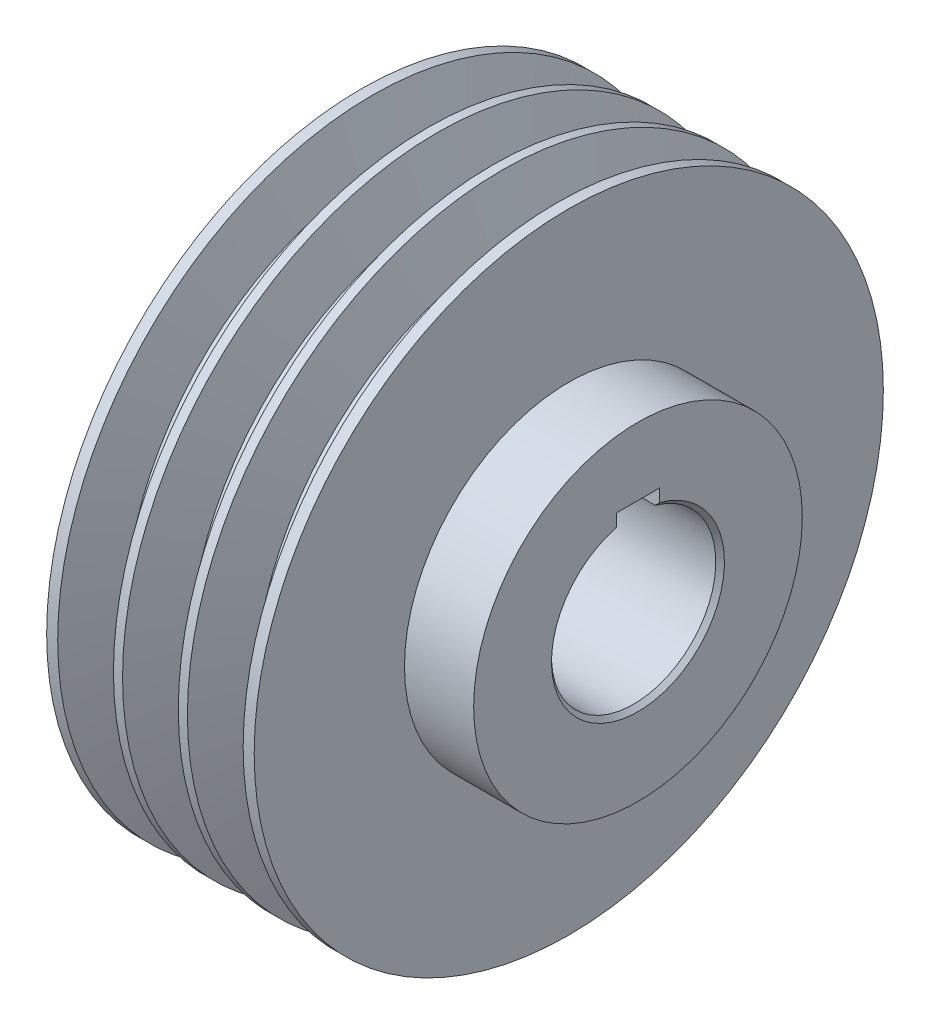
ISO-10303-21;
HEADER;
FILE_DESCRIPTION(('STEP AP214'),'2;1');
FILE_NAME('part.step','',(''),(''),'','','');
FILE_SCHEMA(('AUTOMOTIVE_DESIGN { 1 0 10303 214 1 1 1 1 }'));
ENDSEC;
DATA;
#1=APPLICATION_CONTEXT('core data for automotive mechanical design processes');
#2=APPLICATION_PROTOCOL_DEFINITION('international standard','automotive_design',2000,#1);
#3=PRODUCT_CONTEXT('',#1,'mechanical');
#4=PRODUCT('Part','Part','',(#3));
#5=PRODUCT_RELATED_PRODUCT_CATEGORY('part','',(#4));
#6=PRODUCT_DEFINITION_FORMATION('','',#4);
#7=PRODUCT_DEFINITION_CONTEXT('part definition',#1,'design');
#8=PRODUCT_DEFINITION('design','',#6,#7);
#9=PRODUCT_DEFINITION_SHAPE('','',#8);
#10=(LENGTH_UNIT() NAMED_UNIT(*) SI_UNIT(.MILLI.,.METRE.));
#11=(NAMED_UNIT(*) PLANE_ANGLE_UNIT() SI_UNIT($,.RADIAN.));
#12=(NAMED_UNIT(*) SI_UNIT($,.STERADIAN.) SOLID_ANGLE_UNIT());
#13=UNCERTAINTY_MEASURE_WITH_UNIT(LENGTH_MEASURE(1.E-05),#10,'distance_accuracy_value','');
#14=(GEOMETRIC_REPRESENTATION_CONTEXT(3) GLOBAL_UNCERTAINTY_ASSIGNED_CONTEXT((#13)) GLOBAL_UNIT_ASSIGNED_CONTEXT((#10,
#11,#12)) REPRESENTATION_CONTEXT('',''));
#15=CARTESIAN_POINT('',(0.,0.,0.));
#16=DIRECTION('',(0.,0.,1.));
#17=DIRECTION('',(1.,0.,0.));
#18=AXIS2_PLACEMENT_3D('',#15,#16,#17);
#19=CARTESIAN_POINT('',(0.,0.,0.));
#20=DIRECTION('',(-1.,0.,0.));
#21=DIRECTION('',(0.,0.,1.));
#22=AXIS2_PLACEMENT_3D('',#19,#20,#21);
#23=CYLINDRICAL_SURFACE('',#22,72.75);
#24=CARTESIAN_POINT('',(48.,0.,0.));
#25=DIRECTION('',(-1.,0.,0.));
#26=DIRECTION('',(0.,0.,1.));
#27=AXIS2_PLACEMENT_3D('',#24,#25,#26);
#28=CIRCLE('',#27,72.75);
#29=CARTESIAN_POINT('',(48.,0.,72.75));
#30=VERTEX_POINT('',#29);
#31=EDGE_CURVE('E191',#30,#30,#28,.T.);
#32=ORIENTED_EDGE('',*,*,#31,.T.);
#33=EDGE_LOOP('',(#32));
#34=FACE_BOUND('',#33,.T.);
#35=CARTESIAN_POINT('',(45.4469009365466,0.,0.));
#36=DIRECTION('',(-1.,0.,0.));
#37=DIRECTION('',(0.,0.,1.));
#38=AXIS2_PLACEMENT_3D('',#35,#36,#37);
#39=CIRCLE('',#38,72.75);
#40=CARTESIAN_POINT('',(45.4469009365466,0.,72.75));
#41=VERTEX_POINT('',#40);
#42=EDGE_CURVE('E239',#41,#41,#39,.T.);
#43=ORIENTED_EDGE('',*,*,#42,.F.);
#44=EDGE_LOOP('',(#43));
#45=FACE_BOUND('',#44,.T.);
#46=ADVANCED_FACE('F39',(#34,#45),#23,.T.);
#47=CARTESIAN_POINT('',(30.4469009365466,0.,0.));
#48=DIRECTION('',(-1.,0.,0.));
#49=DIRECTION('',(0.,0.,1.));
#50=AXIS2_PLACEMENT_3D('',#47,#48,#49);
#51=CIRCLE('',#50,72.75);
#52=CARTESIAN_POINT('',(30.4469009365466,0.,72.75));
#53=VERTEX_POINT('',#52);
#54=EDGE_CURVE('E223',#53,#53,#51,.T.);
#55=ORIENTED_EDGE('',*,*,#54,.F.);
#56=EDGE_LOOP('',(#55));
#57=FACE_BOUND('',#56,.T.);
#58=CARTESIAN_POINT('',(32.5530990634534,0.,0.));
#59=DIRECTION('',(-1.,0.,0.));
#60=DIRECTION('',(0.,0.,1.));
#61=AXIS2_PLACEMENT_3D('',#58,#59,#60);
#62=CIRCLE('',#61,72.75);
#63=CARTESIAN_POINT('',(32.5530990634534,0.,72.75));
#64=VERTEX_POINT('',#63);
#65=EDGE_CURVE('E243',#64,#64,#62,.T.);
#66=ORIENTED_EDGE('',*,*,#65,.T.);
#67=EDGE_LOOP('',(#66));
#68=FACE_BOUND('',#67,.T.);
#69=ADVANCED_FACE('F271',(#57,#68),#23,.T.);
#70=CARTESIAN_POINT('',(15.4469009365466,0.,0.));
#71=DIRECTION('',(-1.,0.,0.));
#72=DIRECTION('',(0.,0.,1.));
#73=AXIS2_PLACEMENT_3D('',#70,#71,#72);
#74=CIRCLE('',#73,72.75);
#75=CARTESIAN_POINT('',(15.4469009365466,0.,72.75));
#76=VERTEX_POINT('',#75);
#77=EDGE_CURVE('E207',#76,#76,#74,.T.);
#78=ORIENTED_EDGE('',*,*,#77,.F.);
#79=EDGE_LOOP('',(#78));
#80=FACE_BOUND('',#79,.T.);
#81=CARTESIAN_POINT('',(17.5530990634534,0.,0.));
#82=DIRECTION('',(-1.,0.,0.));
#83=DIRECTION('',(0.,0.,1.));
#84=AXIS2_PLACEMENT_3D('',#81,#82,#83);
#85=CIRCLE('',#84,72.75);
#86=CARTESIAN_POINT('',(17.5530990634534,0.,72.75));
#87=VERTEX_POINT('',#86);
#88=EDGE_CURVE('E227',#87,#87,#85,.T.);
#89=ORIENTED_EDGE('',*,*,#88,.T.);
#90=EDGE_LOOP('',(#89));
#91=FACE_BOUND('',#90,.T.);
#92=ADVANCED_FACE('F278',(#80,#91),#23,.T.);
#93=CARTESIAN_POINT('',(0.,0.,0.));
#94=DIRECTION('',(-1.,0.,0.));
#95=DIRECTION('',(0.,0.,1.));
#96=AXIS2_PLACEMENT_3D('',#93,#94,#95);
#97=CIRCLE('',#96,72.75);
#98=CARTESIAN_POINT('',(0.,0.,72.75));
#99=VERTEX_POINT('',#98);
#100=EDGE_CURVE('E187',#99,#99,#97,.T.);
#101=ORIENTED_EDGE('',*,*,#100,.F.);
#102=EDGE_LOOP('',(#101));
#103=FACE_BOUND('',#102,.T.);
#104=CARTESIAN_POINT('',(2.55309906345343,0.,0.));
#105=DIRECTION('',(-1.,0.,0.));
#106=DIRECTION('',(0.,0.,1.));
#107=AXIS2_PLACEMENT_3D('',#104,#105,#106);
#108=CIRCLE('',#107,72.75);
#109=CARTESIAN_POINT('',(2.55309906345343,0.,72.75));
#110=VERTEX_POINT('',#109);
#111=EDGE_CURVE('E211',#110,#110,#108,.T.);
#112=ORIENTED_EDGE('',*,*,#111,.T.);
#113=EDGE_LOOP('',(#112));
#114=FACE_BOUND('',#113,.T.);
#115=ADVANCED_FACE('F274',(#103,#114),#23,.T.);
#116=CARTESIAN_POINT('',(0.,0.,0.));
#117=DIRECTION('',(-1.,0.,0.));
#118=DIRECTION('',(0.,0.,1.));
#119=AXIS2_PLACEMENT_3D('',#116,#117,#118);
#120=CYLINDRICAL_SURFACE('',#119,19.);
#121=CARTESIAN_POINT('',(0.999999999999987,0.,0.));
#122=DIRECTION('',(1.,0.,0.));
#123=DIRECTION('',(0.,0.,-1.));
#124=AXIS2_PLACEMENT_3D('',#121,#122,#123);
#125=CIRCLE('',#124,19.);
#126=CARTESIAN_POINT('',(0.999999999999984,18.3303027798234,-5.));
#127=VERTEX_POINT('',#126);
#128=CARTESIAN_POINT('',(0.999999999999987,18.3303027798234,4.99999999999999));
#129=VERTEX_POINT('',#128);
#130=EDGE_CURVE('E181',#127,#129,#125,.F.);
#131=ORIENTED_EDGE('',*,*,#130,.T.);
#132=DIRECTION('',(-1.,0.,0.));
#133=VECTOR('',#132,1.);
#134=CARTESIAN_POINT('',(64.,18.3303027798234,5.));
#135=LINE('',#134,#133);
#136=CARTESIAN_POINT('',(63.,18.3303027798234,5.));
#137=VERTEX_POINT('',#136);
#138=EDGE_CURVE('E61',#137,#129,#135,.T.);
#139=ORIENTED_EDGE('',*,*,#138,.F.);
#140=CARTESIAN_POINT('',(63.,0.,0.));
#141=DIRECTION('',(-1.,0.,0.));
#142=DIRECTION('',(0.,0.,1.));
#143=AXIS2_PLACEMENT_3D('',#140,#141,#142);
#144=CIRCLE('',#143,19.);
#145=CARTESIAN_POINT('',(63.,18.3303027798234,-5.));
#146=VERTEX_POINT('',#145);
#147=EDGE_CURVE('E177',#137,#146,#144,.F.);
#148=ORIENTED_EDGE('',*,*,#147,.T.);
#149=DIRECTION('',(-1.,0.,0.));
#150=VECTOR('',#149,1.);
#151=CARTESIAN_POINT('',(64.,18.3303027798234,-5.));
#152=LINE('',#151,#150);
#153=EDGE_CURVE('E116',#146,#127,#152,.T.);
#154=ORIENTED_EDGE('',*,*,#153,.T.);
#155=EDGE_LOOP('',(#131,#139,#148,#154));
#156=FACE_BOUND('',#155,.T.);
#157=ADVANCED_FACE('F284',(#156),#120,.F.);
#158=CARTESIAN_POINT('',(0.,19.,0.));
#159=DIRECTION('',(1.,0.,0.));
#160=DIRECTION('',(0.,0.,-1.));
#161=AXIS2_PLACEMENT_3D('',#158,#159,#160);
#162=PLANE('',#161);
#163=CARTESIAN_POINT('',(0.,0.,0.));
#164=DIRECTION('',(1.,0.,0.));
#165=DIRECTION('',(0.,0.,-1.));
#166=AXIS2_PLACEMENT_3D('',#163,#164,#165);
#167=CIRCLE('',#166,20.);
#168=CARTESIAN_POINT('',(0.,19.3649167310371,5.));
#169=VERTEX_POINT('',#168);
#170=CARTESIAN_POINT('',(0.,19.3649167310371,-5.));
#171=VERTEX_POINT('',#170);
#172=EDGE_CURVE('E173',#169,#171,#167,.T.);
#173=ORIENTED_EDGE('',*,*,#172,.T.);
#174=DIRECTION('',(0.,-1.,0.));
#175=VECTOR('',#174,1.);
#176=CARTESIAN_POINT('',(0.,18.3303027798234,-5.));
#177=LINE('',#176,#175);
#178=CARTESIAN_POINT('',(0.,22.2999999523163,-5.));
#179=VERTEX_POINT('',#178);
#180=EDGE_CURVE('E130',#179,#171,#177,.T.);
#181=ORIENTED_EDGE('',*,*,#180,.F.);
#182=DIRECTION('',(0.,0.,-1.));
#183=VECTOR('',#182,1.);
#184=CARTESIAN_POINT('',(0.,22.2999999523163,-5.));
#185=LINE('',#184,#183);
#186=CARTESIAN_POINT('',(0.,22.2999999523163,5.));
#187=VERTEX_POINT('',#186);
#188=EDGE_CURVE('E127',#187,#179,#185,.T.);
#189=ORIENTED_EDGE('',*,*,#188,.F.);
#190=DIRECTION('',(0.,1.,0.));
#191=VECTOR('',#190,1.);
#192=CARTESIAN_POINT('',(0.,18.3303027798234,5.));
#193=LINE('',#192,#191);
#194=EDGE_CURVE('E104',#169,#187,#193,.T.);
#195=ORIENTED_EDGE('',*,*,#194,.F.);
#196=EDGE_LOOP('',(#173,#181,#189,#195));
#197=FACE_BOUND('',#196,.T.);
#198=ORIENTED_EDGE('',*,*,#100,.T.);
#199=EDGE_LOOP('',(#198));
#200=FACE_BOUND('',#199,.T.);
#201=ADVANCED_FACE('F290',(#197,#200),#162,.F.);
#202=CARTESIAN_POINT('',(48.,72.75,0.));
#203=DIRECTION('',(-1.,0.,0.));
#204=DIRECTION('',(0.,0.,1.));
#205=AXIS2_PLACEMENT_3D('',#202,#203,#204);
#206=PLANE('',#205);
#207=ORIENTED_EDGE('',*,*,#31,.F.);
#208=EDGE_LOOP('',(#207));
#209=FACE_BOUND('',#208,.T.);
#210=CARTESIAN_POINT('',(48.,0.,0.));
#211=DIRECTION('',(-1.,0.,0.));
#212=DIRECTION('',(0.,0.,1.));
#213=AXIS2_PLACEMENT_3D('',#210,#211,#212);
#214=CIRCLE('',#213,38.);
#215=CARTESIAN_POINT('',(48.,0.,38.));
#216=VERTEX_POINT('',#215);
#217=EDGE_CURVE('E195',#216,#216,#214,.T.);
#218=ORIENTED_EDGE('',*,*,#217,.T.);
#219=EDGE_LOOP('',(#218));
#220=FACE_BOUND('',#219,.T.);
#221=ADVANCED_FACE('F321',(#209,#220),#206,.F.);
#222=CARTESIAN_POINT('',(0.,0.,0.));
#223=DIRECTION('',(-1.,0.,0.));
#224=DIRECTION('',(0.,0.,1.));
#225=AXIS2_PLACEMENT_3D('',#222,#223,#224);
#226=CYLINDRICAL_SURFACE('',#225,38.);
#227=ORIENTED_EDGE('',*,*,#217,.F.);
#228=EDGE_LOOP('',(#227));
#229=FACE_BOUND('',#228,.T.);
#230=CARTESIAN_POINT('',(64.,0.,0.));
#231=DIRECTION('',(-1.,0.,0.));
#232=DIRECTION('',(0.,0.,1.));
#233=AXIS2_PLACEMENT_3D('',#230,#231,#232);
#234=CIRCLE('',#233,38.);
#235=CARTESIAN_POINT('',(64.,0.,38.));
#236=VERTEX_POINT('',#235);
#237=EDGE_CURVE('E199',#236,#236,#234,.T.);
#238=ORIENTED_EDGE('',*,*,#237,.T.);
#239=EDGE_LOOP('',(#238));
#240=FACE_BOUND('',#239,.T.);
#241=ADVANCED_FACE('F319',(#229,#240),#226,.T.);
#242=CARTESIAN_POINT('',(64.,38.,0.));
#243=DIRECTION('',(-1.,0.,0.));
#244=DIRECTION('',(0.,0.,1.));
#245=AXIS2_PLACEMENT_3D('',#242,#243,#244);
#246=PLANE('',#245);
#247=DIRECTION('',(0.,0.,-1.));
#248=VECTOR('',#247,1.);
#249=CARTESIAN_POINT('',(64.,22.2999999523163,-5.));
#250=LINE('',#249,#248);
#251=CARTESIAN_POINT('',(64.,22.2999999523163,5.));
#252=VERTEX_POINT('',#251);
#253=CARTESIAN_POINT('',(64.,22.2999999523163,-5.));
#254=VERTEX_POINT('',#253);
#255=EDGE_CURVE('E112',#252,#254,#250,.T.);
#256=ORIENTED_EDGE('',*,*,#255,.T.);
#257=DIRECTION('',(0.,-1.,0.));
#258=VECTOR('',#257,1.);
#259=CARTESIAN_POINT('',(64.,18.3303027798234,-5.));
#260=LINE('',#259,#258);
#261=CARTESIAN_POINT('',(64.,19.3649167310371,-5.));
#262=VERTEX_POINT('',#261);
#263=EDGE_CURVE('E124',#254,#262,#260,.T.);
#264=ORIENTED_EDGE('',*,*,#263,.T.);
#265=CARTESIAN_POINT('',(64.,0.,0.));
#266=DIRECTION('',(-1.,0.,0.));
#267=DIRECTION('',(0.,0.,1.));
#268=AXIS2_PLACEMENT_3D('',#265,#266,#267);
#269=CIRCLE('',#268,20.);
#270=CARTESIAN_POINT('',(64.,19.3649167310371,5.));
#271=VERTEX_POINT('',#270);
#272=EDGE_CURVE('E122',#262,#271,#269,.T.);
#273=ORIENTED_EDGE('',*,*,#272,.T.);
#274=DIRECTION('',(0.,1.,0.));
#275=VECTOR('',#274,1.);
#276=CARTESIAN_POINT('',(64.,18.3303027798234,5.));
#277=LINE('',#276,#275);
#278=EDGE_CURVE('E101',#271,#252,#277,.T.);
#279=ORIENTED_EDGE('',*,*,#278,.T.);
#280=EDGE_LOOP('',(#256,#264,#273,#279));
#281=FACE_BOUND('',#280,.T.);
#282=ORIENTED_EDGE('',*,*,#237,.F.);
#283=EDGE_LOOP('',(#282));
#284=FACE_BOUND('',#283,.T.);
#285=ADVANCED_FACE('F119',(#281,#284),#246,.F.);
#286=CARTESIAN_POINT('',(0.,0.,0.));
#287=DIRECTION('',(-1.,0.,0.));
#288=DIRECTION('',(0.,0.,1.));
#289=AXIS2_PLACEMENT_3D('',#286,#287,#288);
#290=CYLINDRICAL_SURFACE('',#289,61.3);
#291=CARTESIAN_POINT('',(11.5043497643799,0.,0.));
#292=DIRECTION('',(-1.,0.,0.));
#293=DIRECTION('',(0.,0.,1.));
#294=AXIS2_PLACEMENT_3D('',#291,#292,#293);
#295=CIRCLE('',#294,61.3);
#296=CARTESIAN_POINT('',(11.5043497643799,0.,61.3));
#297=VERTEX_POINT('',#296);
#298=EDGE_CURVE('E203',#297,#297,#295,.T.);
#299=ORIENTED_EDGE('',*,*,#298,.T.);
#300=EDGE_LOOP('',(#299));
#301=FACE_BOUND('',#300,.T.);
#302=CARTESIAN_POINT('',(6.49565023562005,0.,0.));
#303=DIRECTION('',(-1.,0.,0.));
#304=DIRECTION('',(0.,0.,1.));
#305=AXIS2_PLACEMENT_3D('',#302,#303,#304);
#306=CIRCLE('',#305,61.3);
#307=CARTESIAN_POINT('',(6.49565023562005,0.,61.3));
#308=VERTEX_POINT('',#307);
#309=EDGE_CURVE('E215',#308,#308,#306,.T.);
#310=ORIENTED_EDGE('',*,*,#309,.F.);
#311=EDGE_LOOP('',(#310));
#312=FACE_BOUND('',#311,.T.);
#313=ADVANCED_FACE('F309',(#301,#312),#290,.T.);
#314=CARTESIAN_POINT('',(11.5043497643799,0.,0.));
#315=DIRECTION('',(1.,0.,0.));
#316=DIRECTION('',(0.,0.,-1.));
#317=AXIS2_PLACEMENT_3D('',#314,#315,#316);
#318=CONICAL_SURFACE('',#317,61.3,1.23918376891598);
#319=ORIENTED_EDGE('',*,*,#77,.T.);
#320=EDGE_LOOP('',(#319));
#321=FACE_BOUND('',#320,.T.);
#322=ORIENTED_EDGE('',*,*,#298,.F.);
#323=EDGE_LOOP('',(#322));
#324=FACE_BOUND('',#323,.T.);
#325=ADVANCED_FACE('F300',(#321,#324),#318,.T.);
#326=CARTESIAN_POINT('',(2.55309906345343,0.,0.));
#327=DIRECTION('',(-1.,0.,0.));
#328=DIRECTION('',(0.,0.,1.));
#329=AXIS2_PLACEMENT_3D('',#326,#327,#328);
#330=CONICAL_SURFACE('',#329,72.75,1.23918376891598);
#331=ORIENTED_EDGE('',*,*,#309,.T.);
#332=EDGE_LOOP('',(#331));
#333=FACE_BOUND('',#332,.T.);
#334=ORIENTED_EDGE('',*,*,#111,.F.);
#335=EDGE_LOOP('',(#334));
#336=FACE_BOUND('',#335,.T.);
#337=ADVANCED_FACE('F297',(#333,#336),#330,.T.);
#338=CARTESIAN_POINT('',(15.,0.,0.));
#339=DIRECTION('',(-1.,0.,0.));
#340=DIRECTION('',(0.,0.,1.));
#341=AXIS2_PLACEMENT_3D('',#338,#339,#340);
#342=CYLINDRICAL_SURFACE('',#341,61.3);
#343=CARTESIAN_POINT('',(26.5043497643799,0.,0.));
#344=DIRECTION('',(-1.,0.,0.));
#345=DIRECTION('',(0.,0.,1.));
#346=AXIS2_PLACEMENT_3D('',#343,#344,#345);
#347=CIRCLE('',#346,61.3);
#348=CARTESIAN_POINT('',(26.5043497643799,0.,61.3));
#349=VERTEX_POINT('',#348);
#350=EDGE_CURVE('E219',#349,#349,#347,.T.);
#351=ORIENTED_EDGE('',*,*,#350,.T.);
#352=EDGE_LOOP('',(#351));
#353=FACE_BOUND('',#352,.T.);
#354=CARTESIAN_POINT('',(21.4956502356201,0.,0.));
#355=DIRECTION('',(-1.,0.,0.));
#356=DIRECTION('',(0.,0.,1.));
#357=AXIS2_PLACEMENT_3D('',#354,#355,#356);
#358=CIRCLE('',#357,61.3);
#359=CARTESIAN_POINT('',(21.4956502356201,0.,61.3));
#360=VERTEX_POINT('',#359);
#361=EDGE_CURVE('E231',#360,#360,#358,.T.);
#362=ORIENTED_EDGE('',*,*,#361,.F.);
#363=EDGE_LOOP('',(#362));
#364=FACE_BOUND('',#363,.T.);
#365=ADVANCED_FACE('F299',(#353,#364),#342,.T.);
#366=CARTESIAN_POINT('',(26.5043497643799,0.,0.));
#367=DIRECTION('',(1.,0.,0.));
#368=DIRECTION('',(0.,0.,-1.));
#369=AXIS2_PLACEMENT_3D('',#366,#367,#368);
#370=CONICAL_SURFACE('',#369,61.3,1.23918376891598);
#371=ORIENTED_EDGE('',*,*,#54,.T.);
#372=EDGE_LOOP('',(#371));
#373=FACE_BOUND('',#372,.T.);
#374=ORIENTED_EDGE('',*,*,#350,.F.);
#375=EDGE_LOOP('',(#374));
#376=FACE_BOUND('',#375,.T.);
#377=ADVANCED_FACE('F267',(#373,#376),#370,.T.);
#378=CARTESIAN_POINT('',(17.5530990634534,0.,0.));
#379=DIRECTION('',(-1.,0.,0.));
#380=DIRECTION('',(0.,0.,1.));
#381=AXIS2_PLACEMENT_3D('',#378,#379,#380);
#382=CONICAL_SURFACE('',#381,72.75,1.23918376891598);
#383=ORIENTED_EDGE('',*,*,#361,.T.);
#384=EDGE_LOOP('',(#383));
#385=FACE_BOUND('',#384,.T.);
#386=ORIENTED_EDGE('',*,*,#88,.F.);
#387=EDGE_LOOP('',(#386));
#388=FACE_BOUND('',#387,.T.);
#389=ADVANCED_FACE('F258',(#385,#388),#382,.T.);
#390=CARTESIAN_POINT('',(30.,0.,0.));
#391=DIRECTION('',(-1.,0.,0.));
#392=DIRECTION('',(0.,0.,1.));
#393=AXIS2_PLACEMENT_3D('',#390,#391,#392);
#394=CYLINDRICAL_SURFACE('',#393,61.3);
#395=CARTESIAN_POINT('',(41.5043497643799,0.,0.));
#396=DIRECTION('',(-1.,0.,0.));
#397=DIRECTION('',(0.,0.,1.));
#398=AXIS2_PLACEMENT_3D('',#395,#396,#397);
#399=CIRCLE('',#398,61.3);
#400=CARTESIAN_POINT('',(41.5043497643799,0.,61.3));
#401=VERTEX_POINT('',#400);
#402=EDGE_CURVE('E235',#401,#401,#399,.T.);
#403=ORIENTED_EDGE('',*,*,#402,.T.);
#404=EDGE_LOOP('',(#403));
#405=FACE_BOUND('',#404,.T.);
#406=CARTESIAN_POINT('',(36.4956502356201,0.,0.));
#407=DIRECTION('',(-1.,0.,0.));
#408=DIRECTION('',(0.,0.,1.));
#409=AXIS2_PLACEMENT_3D('',#406,#407,#408);
#410=CIRCLE('',#409,61.3);
#411=CARTESIAN_POINT('',(36.4956502356201,0.,61.3));
#412=VERTEX_POINT('',#411);
#413=EDGE_CURVE('E246',#412,#412,#410,.T.);
#414=ORIENTED_EDGE('',*,*,#413,.F.);
#415=EDGE_LOOP('',(#414));
#416=FACE_BOUND('',#415,.T.);
#417=ADVANCED_FACE('F255',(#405,#416),#394,.T.);
#418=CARTESIAN_POINT('',(41.5043497643799,0.,0.));
#419=DIRECTION('',(1.,0.,0.));
#420=DIRECTION('',(0.,0.,-1.));
#421=AXIS2_PLACEMENT_3D('',#418,#419,#420);
#422=CONICAL_SURFACE('',#421,61.3,1.23918376891598);
#423=ORIENTED_EDGE('',*,*,#42,.T.);
#424=EDGE_LOOP('',(#423));
#425=FACE_BOUND('',#424,.T.);
#426=ORIENTED_EDGE('',*,*,#402,.F.);
#427=EDGE_LOOP('',(#426));
#428=FACE_BOUND('',#427,.T.);
#429=ADVANCED_FACE('F257',(#425,#428),#422,.T.);
#430=CARTESIAN_POINT('',(32.5530990634534,0.,0.));
#431=DIRECTION('',(-1.,0.,0.));
#432=DIRECTION('',(0.,0.,1.));
#433=AXIS2_PLACEMENT_3D('',#430,#431,#432);
#434=CONICAL_SURFACE('',#433,72.75,1.23918376891598);
#435=ORIENTED_EDGE('',*,*,#413,.T.);
#436=EDGE_LOOP('',(#435));
#437=FACE_BOUND('',#436,.T.);
#438=ORIENTED_EDGE('',*,*,#65,.F.);
#439=EDGE_LOOP('',(#438));
#440=FACE_BOUND('',#439,.T.);
#441=ADVANCED_FACE('F252',(#437,#440),#434,.T.);
#442=CARTESIAN_POINT('',(64.,0.,0.));
#443=DIRECTION('',(1.,0.,0.));
#444=DIRECTION('',(0.,0.,-1.));
#445=AXIS2_PLACEMENT_3D('',#442,#443,#444);
#446=CONICAL_SURFACE('',#445,20.,0.785398163397445);
#447=CARTESIAN_POINT('',(60.5888157141485,15.8173577691718,-5.));
#448=CARTESIAN_POINT('',(61.0266243942649,16.2764840077235,-5.));
#449=CARTESIAN_POINT('',(61.4653025120661,16.7347791145518,-5.));
#450=CARTESIAN_POINT('',(62.3440880151486,17.6499914964766,-5.));
#451=CARTESIAN_POINT('',(62.7841953910585,18.1069087805695,-5.));
#452=CARTESIAN_POINT('',(63.6655344249782,19.0196547949426,-5.));
#453=CARTESIAN_POINT('',(64.1067660801398,19.4754835279748,-5.));
#454=CARTESIAN_POINT('',(64.9901600407615,20.3862441893698,-5.));
#455=CARTESIAN_POINT('',(65.4323223522601,20.8411761118762,-5.));
#456=CARTESIAN_POINT('',(65.8748497474771,21.2957519584235,-5.));
#457=B_SPLINE_CURVE_WITH_KNOTS('',3,(#447,#448,#449,#450,#451,#452,#453,#454,#455,#456),
.UNSPECIFIED.,.F.,.F.,(4,2,2,2,4),(0.,1.90322032757419,3.80642820111646,5.70963125795044,
7.61284670212679),.UNSPECIFIED.);
#458=EDGE_CURVE('E69',#146,#262,#457,.T.);
#459=ORIENTED_EDGE('',*,*,#458,.F.);
#460=ORIENTED_EDGE('',*,*,#147,.F.);
#461=CARTESIAN_POINT('',(65.8748497474771,21.2957519584235,5.));
#462=CARTESIAN_POINT('',(65.4323223522601,20.8411761118762,5.));
#463=CARTESIAN_POINT('',(64.9901600407615,20.3862441893698,5.));
#464=CARTESIAN_POINT('',(64.1067660801398,19.4754835279748,5.));
#465=CARTESIAN_POINT('',(63.6655344249782,19.0196547949426,5.));
#466=CARTESIAN_POINT('',(62.7841953910585,18.1069087805695,5.));
#467=CARTESIAN_POINT('',(62.3440880151486,17.6499914964766,5.));
#468=CARTESIAN_POINT('',(61.4653025120661,16.7347791145518,5.));
#469=CARTESIAN_POINT('',(61.0266243942649,16.2764840077235,5.));
#470=CARTESIAN_POINT('',(60.5888157141485,15.8173577691718,5.));
#471=B_SPLINE_CURVE_WITH_KNOTS('',3,(#461,#462,#463,#464,#465,#466,#467,#468,#469,#470),
.UNSPECIFIED.,.F.,.F.,(4,2,2,2,4),(0.,1.90321544417633,3.80641850101033,5.70962637455261,
7.61284670212679),.UNSPECIFIED.);
#472=EDGE_CURVE('E138',#271,#137,#471,.T.);
#473=ORIENTED_EDGE('',*,*,#472,.F.);
#474=ORIENTED_EDGE('',*,*,#272,.F.);
#475=EDGE_LOOP('',(#459,#460,#473,#474));
#476=FACE_BOUND('',#475,.T.);
#477=ADVANCED_FACE('F157',(#476),#446,.F.);
#478=CARTESIAN_POINT('',(0.999999999999987,0.,0.));
#479=DIRECTION('',(-1.,0.,0.));
#480=DIRECTION('',(0.,0.,1.));
#481=AXIS2_PLACEMENT_3D('',#478,#479,#480);
#482=CONICAL_SURFACE('',#481,19.,0.785398163397452);
#483=CARTESIAN_POINT('',(-2.32676558668921,21.7596981036725,-5.));
#484=CARTESIAN_POINT('',(-1.8839871675334,21.3053674507558,-5.));
#485=CARTESIAN_POINT('',(-1.4415520109982,20.8507016880387,-5.));
#486=CARTESIAN_POINT('',(-0.557551034581018,19.9405309073722,-5.));
#487=CARTESIAN_POINT('',(-0.115985209822122,19.4850258941589,-5.));
#488=CARTESIAN_POINT('',(0.76610022019932,18.5730014942486,-5.));
#489=CARTESIAN_POINT('',(1.20661982322449,18.1164821053865,-5.));
#490=CARTESIAN_POINT('',(2.08633751234062,17.2021670930457,-5.));
#491=CARTESIAN_POINT('',(2.5255355909453,16.7443714623656,-5.));
#492=CARTESIAN_POINT('',(2.96393323886569,16.2858088742876,-5.));
#493=B_SPLINE_CURVE_WITH_KNOTS('',3,(#483,#484,#485,#486,#487,#488,#489,#490,#491,#492),
.UNSPECIFIED.,.F.,.F.,(4,2,2,2,4),(0.,1.90321389699125,3.80641708642857,5.7096243422649,
7.61284235932686),.UNSPECIFIED.);
#494=EDGE_CURVE('E11',#171,#127,#493,.T.);
#495=ORIENTED_EDGE('',*,*,#494,.F.);
#496=ORIENTED_EDGE('',*,*,#172,.F.);
#497=CARTESIAN_POINT('',(2.96393323886569,16.2858088742876,5.));
#498=CARTESIAN_POINT('',(2.5255355909453,16.7443714623656,5.));
#499=CARTESIAN_POINT('',(2.08633751234062,17.2021670930457,5.));
#500=CARTESIAN_POINT('',(1.20661982322449,18.1164821053865,5.));
#501=CARTESIAN_POINT('',(0.766100220199322,18.5730014942486,5.));
#502=CARTESIAN_POINT('',(-0.115985209822121,19.4850258941589,5.));
#503=CARTESIAN_POINT('',(-0.557551034581018,19.9405309073722,5.));
#504=CARTESIAN_POINT('',(-1.4415520109982,20.8507016880387,5.));
#505=CARTESIAN_POINT('',(-1.8839871675334,21.3053674507558,5.));
#506=CARTESIAN_POINT('',(-2.32676558668921,21.7596981036725,5.));
#507=B_SPLINE_CURVE_WITH_KNOTS('',3,(#497,#498,#499,#500,#501,#502,#503,#504,#505,#506),
.UNSPECIFIED.,.F.,.F.,(4,2,2,2,4),(0.,1.90321801706196,3.80642527289829,5.70962846233561,
7.61284235932686),.UNSPECIFIED.);
#508=EDGE_CURVE('E54',#129,#169,#507,.T.);
#509=ORIENTED_EDGE('',*,*,#508,.F.);
#510=ORIENTED_EDGE('',*,*,#130,.F.);
#511=EDGE_LOOP('',(#495,#496,#509,#510));
#512=FACE_BOUND('',#511,.T.);
#513=ADVANCED_FACE('F41',(#512),#482,.F.);
#514=CARTESIAN_POINT('',(64.,18.3303027798234,-5.));
#515=DIRECTION('',(0.,0.,-1.));
#516=DIRECTION('',(-1.,0.,0.));
#517=AXIS2_PLACEMENT_3D('',#514,#515,#516);
#518=PLANE('',#517);
#519=ORIENTED_EDGE('',*,*,#458,.T.);
#520=ORIENTED_EDGE('',*,*,#263,.F.);
#521=DIRECTION('',(-1.,0.,0.));
#522=VECTOR('',#521,1.);
#523=CARTESIAN_POINT('',(64.,22.2999999523163,-5.));
#524=LINE('',#523,#522);
#525=EDGE_CURVE('E109',#254,#179,#524,.T.);
#526=ORIENTED_EDGE('',*,*,#525,.T.);
#527=ORIENTED_EDGE('',*,*,#180,.T.);
#528=ORIENTED_EDGE('',*,*,#494,.T.);
#529=ORIENTED_EDGE('',*,*,#153,.F.);
#530=EDGE_LOOP('',(#519,#520,#526,#527,#528,#529));
#531=FACE_BOUND('',#530,.T.);
#532=ADVANCED_FACE('F163',(#531),#518,.F.);
#533=CARTESIAN_POINT('',(64.,22.2999999523163,-5.));
#534=DIRECTION('',(0.,1.,0.));
#535=DIRECTION('',(0.,0.,1.));
#536=AXIS2_PLACEMENT_3D('',#533,#534,#535);
#537=PLANE('',#536);
#538=ORIENTED_EDGE('',*,*,#188,.T.);
#539=ORIENTED_EDGE('',*,*,#525,.F.);
#540=ORIENTED_EDGE('',*,*,#255,.F.);
#541=DIRECTION('',(-1.,0.,0.));
#542=VECTOR('',#541,1.);
#543=CARTESIAN_POINT('',(64.,22.2999999523163,5.));
#544=LINE('',#543,#542);
#545=EDGE_CURVE('E97',#252,#187,#544,.T.);
#546=ORIENTED_EDGE('',*,*,#545,.T.);
#547=EDGE_LOOP('',(#538,#539,#540,#546));
#548=FACE_BOUND('',#547,.T.);
#549=ADVANCED_FACE('F113',(#548),#537,.F.);
#550=CARTESIAN_POINT('',(64.,18.3303027798234,5.));
#551=DIRECTION('',(0.,0.,1.));
#552=DIRECTION('',(1.,0.,0.));
#553=AXIS2_PLACEMENT_3D('',#550,#551,#552);
#554=PLANE('',#553);
#555=ORIENTED_EDGE('',*,*,#472,.T.);
#556=ORIENTED_EDGE('',*,*,#138,.T.);
#557=ORIENTED_EDGE('',*,*,#508,.T.);
#558=ORIENTED_EDGE('',*,*,#194,.T.);
#559=ORIENTED_EDGE('',*,*,#545,.F.);
#560=ORIENTED_EDGE('',*,*,#278,.F.);
#561=EDGE_LOOP('',(#555,#556,#557,#558,#559,#560));
#562=FACE_BOUND('',#561,.T.);
#563=ADVANCED_FACE('F99',(#562),#554,.F.);
#564=CLOSED_SHELL('',(#46,#69,#92,#115,#157,#201,#221,#241,#285,#313,#325,#337,#365,#377,#389,
#417,#429,#441,#477,#513,#532,#549,#563));
#565=MANIFOLD_SOLID_BREP('B2',#564);
#566=ADVANCED_BREP_SHAPE_REPRESENTATION('',(#18,#565),#14);
#567=SHAPE_DEFINITION_REPRESENTATION(#9,#566);
ENDSEC;
END-ISO-10303-21;
